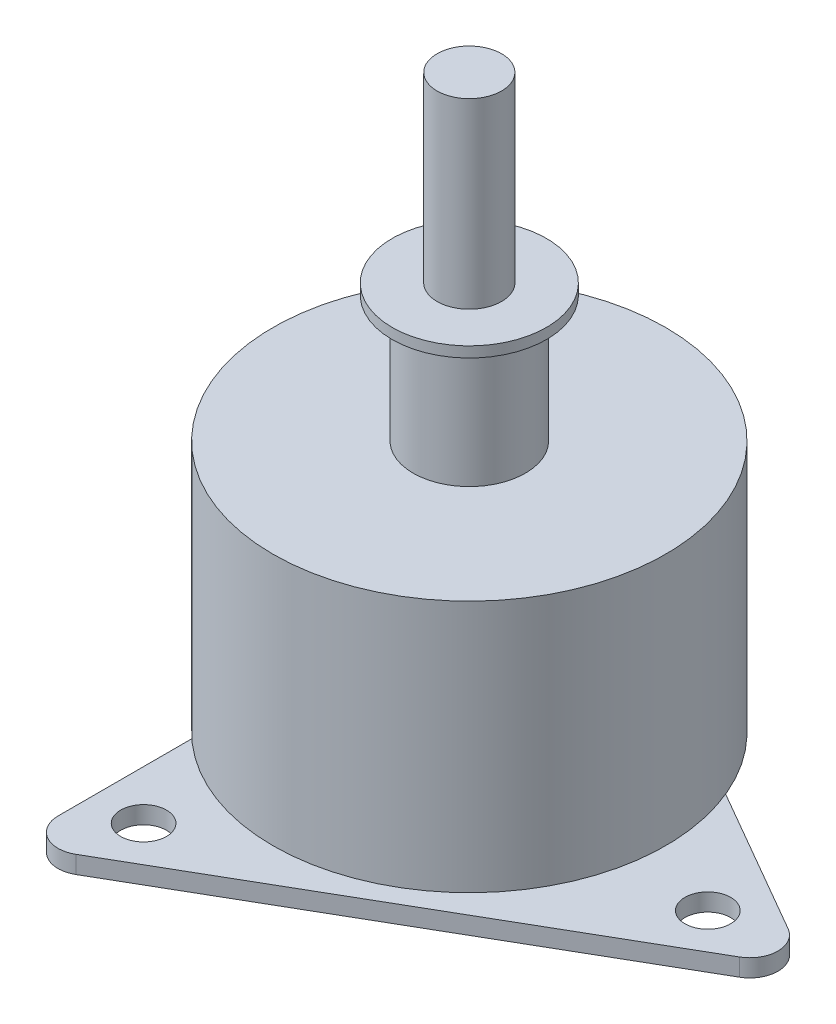
ISO-10303-21;
HEADER;
FILE_DESCRIPTION(('STEP AP214'),'2;1');
FILE_NAME('part.step','',(''),(''),'','','');
FILE_SCHEMA(('AUTOMOTIVE_DESIGN { 1 0 10303 214 1 1 1 1 }'));
ENDSEC;
DATA;
#1=APPLICATION_CONTEXT('core data for automotive mechanical design processes');
#2=APPLICATION_PROTOCOL_DEFINITION('international standard','automotive_design',2000,#1);
#3=PRODUCT_CONTEXT('',#1,'mechanical');
#4=PRODUCT('Part','Part','',(#3));
#5=PRODUCT_RELATED_PRODUCT_CATEGORY('part','',(#4));
#6=PRODUCT_DEFINITION_FORMATION('','',#4);
#7=PRODUCT_DEFINITION_CONTEXT('part definition',#1,'design');
#8=PRODUCT_DEFINITION('design','',#6,#7);
#9=PRODUCT_DEFINITION_SHAPE('','',#8);
#10=(LENGTH_UNIT() NAMED_UNIT(*) SI_UNIT(.MILLI.,.METRE.));
#11=(NAMED_UNIT(*) PLANE_ANGLE_UNIT() SI_UNIT($,.RADIAN.));
#12=(NAMED_UNIT(*) SI_UNIT($,.STERADIAN.) SOLID_ANGLE_UNIT());
#13=UNCERTAINTY_MEASURE_WITH_UNIT(LENGTH_MEASURE(1.E-05),#10,'distance_accuracy_value','');
#14=(GEOMETRIC_REPRESENTATION_CONTEXT(3) GLOBAL_UNCERTAINTY_ASSIGNED_CONTEXT((#13)) GLOBAL_UNIT_ASSIGNED_CONTEXT((#10,
#11,#12)) REPRESENTATION_CONTEXT('',''));
#15=CARTESIAN_POINT('',(0.,0.,0.));
#16=DIRECTION('',(0.,0.,1.));
#17=DIRECTION('',(1.,0.,0.));
#18=AXIS2_PLACEMENT_3D('',#15,#16,#17);
#19=CARTESIAN_POINT('',(0.,0.,0.));
#20=DIRECTION('',(0.,1.,0.));
#21=DIRECTION('',(0.,0.,1.));
#22=AXIS2_PLACEMENT_3D('',#19,#20,#21);
#23=PLANE('',#22);
#24=DIRECTION('',(0.866025403784439,0.,-0.5));
#25=VECTOR('',#24,1.);
#26=CARTESIAN_POINT('',(-12.,0.,20.7846096908265));
#27=LINE('',#26,#25);
#28=CARTESIAN_POINT('',(-9.,0.,19.0525588832576));
#29=VERTEX_POINT('',#28);
#30=CARTESIAN_POINT('',(21.,0.,1.73205080756887));
#31=VERTEX_POINT('',#30);
#32=EDGE_CURVE('E107',#29,#31,#27,.T.);
#33=ORIENTED_EDGE('',*,*,#32,.F.);
#34=CARTESIAN_POINT('',(-10.,0.,17.3205080756888));
#35=DIRECTION('',(0.,1.,0.));
#36=DIRECTION('',(0.,0.,1.));
#37=AXIS2_PLACEMENT_3D('',#34,#35,#36);
#38=CIRCLE('',#37,2.);
#39=CARTESIAN_POINT('',(-12.,0.,17.3205080756888));
#40=VERTEX_POINT('',#39);
#41=EDGE_CURVE('E90',#29,#40,#38,.F.);
#42=ORIENTED_EDGE('',*,*,#41,.T.);
#43=DIRECTION('',(0.,0.,1.));
#44=VECTOR('',#43,1.);
#45=CARTESIAN_POINT('',(-12.,0.,-20.7846096908265));
#46=LINE('',#45,#44);
#47=CARTESIAN_POINT('',(-12.,0.,-17.3205080756888));
#48=VERTEX_POINT('',#47);
#49=EDGE_CURVE('E118',#48,#40,#46,.T.);
#50=ORIENTED_EDGE('',*,*,#49,.F.);
#51=CARTESIAN_POINT('',(-10.,0.,-17.3205080756888));
#52=DIRECTION('',(0.,1.,0.));
#53=DIRECTION('',(0.,0.,1.));
#54=AXIS2_PLACEMENT_3D('',#51,#52,#53);
#55=CIRCLE('',#54,2.);
#56=CARTESIAN_POINT('',(-9.,0.,-19.0525588832577));
#57=VERTEX_POINT('',#56);
#58=EDGE_CURVE('E101',#48,#57,#55,.F.);
#59=ORIENTED_EDGE('',*,*,#58,.T.);
#60=DIRECTION('',(-0.866025403784439,0.,-0.5));
#61=VECTOR('',#60,1.);
#62=CARTESIAN_POINT('',(24.,0.,0.));
#63=LINE('',#62,#61);
#64=CARTESIAN_POINT('',(21.,0.,-1.73205080756889));
#65=VERTEX_POINT('',#64);
#66=EDGE_CURVE('E115',#65,#57,#63,.T.);
#67=ORIENTED_EDGE('',*,*,#66,.F.);
#68=CARTESIAN_POINT('',(20.,0.,0.));
#69=DIRECTION('',(0.,1.,0.));
#70=DIRECTION('',(0.,0.,1.));
#71=AXIS2_PLACEMENT_3D('',#68,#69,#70);
#72=CIRCLE('',#71,2.);
#73=EDGE_CURVE('E110',#65,#31,#72,.F.);
#74=ORIENTED_EDGE('',*,*,#73,.T.);
#75=EDGE_LOOP('',(#33,#42,#50,#59,#67,#74));
#76=FACE_BOUND('',#75,.T.);
#77=CARTESIAN_POINT('',(17.,0.,0.));
#78=DIRECTION('',(0.,1.,0.));
#79=DIRECTION('',(0.,0.,1.));
#80=AXIS2_PLACEMENT_3D('',#77,#78,#79);
#81=CIRCLE('',#80,1.63194999999999);
#82=CARTESIAN_POINT('',(17.,0.,1.63194999999999));
#83=VERTEX_POINT('',#82);
#84=EDGE_CURVE('E116',#83,#83,#81,.F.);
#85=ORIENTED_EDGE('',*,*,#84,.F.);
#86=EDGE_LOOP('',(#85));
#87=FACE_BOUND('',#86,.T.);
#88=CARTESIAN_POINT('',(-8.5,0.,14.7224318643355));
#89=DIRECTION('',(0.,1.,0.));
#90=DIRECTION('',(0.,0.,1.));
#91=AXIS2_PLACEMENT_3D('',#88,#89,#90);
#92=CIRCLE('',#91,1.63194999999999);
#93=CARTESIAN_POINT('',(-8.5,0.,16.3543818643355));
#94=VERTEX_POINT('',#93);
#95=EDGE_CURVE('E157',#94,#94,#92,.F.);
#96=ORIENTED_EDGE('',*,*,#95,.F.);
#97=EDGE_LOOP('',(#96));
#98=FACE_BOUND('',#97,.T.);
#99=CARTESIAN_POINT('',(-8.5,0.,-14.7224318643355));
#100=DIRECTION('',(0.,1.,0.));
#101=DIRECTION('',(0.,0.,1.));
#102=AXIS2_PLACEMENT_3D('',#99,#100,#101);
#103=CIRCLE('',#102,1.63194999999999);
#104=CARTESIAN_POINT('',(-8.5,0.,-13.0904818643355));
#105=VERTEX_POINT('',#104);
#106=EDGE_CURVE('E162',#105,#105,#103,.F.);
#107=ORIENTED_EDGE('',*,*,#106,.F.);
#108=EDGE_LOOP('',(#107));
#109=FACE_BOUND('',#108,.T.);
#110=CARTESIAN_POINT('',(0.,0.,0.));
#111=DIRECTION('',(0.,1.,0.));
#112=DIRECTION('',(0.,0.,1.));
#113=AXIS2_PLACEMENT_3D('',#110,#111,#112);
#114=CIRCLE('',#113,7.5);
#115=CARTESIAN_POINT('',(0.,0.,7.5));
#116=VERTEX_POINT('',#115);
#117=EDGE_CURVE('E128',#116,#116,#114,.F.);
#118=ORIENTED_EDGE('',*,*,#117,.F.);
#119=EDGE_LOOP('',(#118));
#120=FACE_BOUND('',#119,.T.);
#121=ADVANCED_FACE('F37',(#76,#87,#98,#109,#120),#23,.F.);
#122=CARTESIAN_POINT('',(0.,1.25,0.));
#123=DIRECTION('',(0.,1.,0.));
#124=DIRECTION('',(0.,0.,1.));
#125=AXIS2_PLACEMENT_3D('',#122,#123,#124);
#126=PLANE('',#125);
#127=DIRECTION('',(0.,0.,1.));
#128=VECTOR('',#127,1.);
#129=CARTESIAN_POINT('',(-12.,1.25,-20.7846096908265));
#130=LINE('',#129,#128);
#131=CARTESIAN_POINT('',(-12.,1.25,-17.3205080756888));
#132=VERTEX_POINT('',#131);
#133=CARTESIAN_POINT('',(-12.,1.25,17.3205080756888));
#134=VERTEX_POINT('',#133);
#135=EDGE_CURVE('E124',#132,#134,#130,.T.);
#136=ORIENTED_EDGE('',*,*,#135,.T.);
#137=CARTESIAN_POINT('',(-10.,1.25,17.3205080756888));
#138=DIRECTION('',(0.,1.,0.));
#139=DIRECTION('',(0.,0.,1.));
#140=AXIS2_PLACEMENT_3D('',#137,#138,#139);
#141=CIRCLE('',#140,2.);
#142=CARTESIAN_POINT('',(-9.,1.25,19.0525588832576));
#143=VERTEX_POINT('',#142);
#144=EDGE_CURVE('E140',#134,#143,#141,.T.);
#145=ORIENTED_EDGE('',*,*,#144,.T.);
#146=DIRECTION('',(0.866025403784439,0.,-0.5));
#147=VECTOR('',#146,1.);
#148=CARTESIAN_POINT('',(-12.,1.25,20.7846096908265));
#149=LINE('',#148,#147);
#150=CARTESIAN_POINT('',(21.,1.25,1.73205080756887));
#151=VERTEX_POINT('',#150);
#152=EDGE_CURVE('E109',#143,#151,#149,.T.);
#153=ORIENTED_EDGE('',*,*,#152,.T.);
#154=CARTESIAN_POINT('',(20.,1.25,0.));
#155=DIRECTION('',(0.,1.,0.));
#156=DIRECTION('',(0.,0.,1.));
#157=AXIS2_PLACEMENT_3D('',#154,#155,#156);
#158=CIRCLE('',#157,2.);
#159=CARTESIAN_POINT('',(21.,1.25,-1.73205080756889));
#160=VERTEX_POINT('',#159);
#161=EDGE_CURVE('E57',#151,#160,#158,.T.);
#162=ORIENTED_EDGE('',*,*,#161,.T.);
#163=DIRECTION('',(-0.866025403784439,0.,-0.5));
#164=VECTOR('',#163,1.);
#165=CARTESIAN_POINT('',(24.,1.25,0.));
#166=LINE('',#165,#164);
#167=CARTESIAN_POINT('',(-9.,1.25,-19.0525588832577));
#168=VERTEX_POINT('',#167);
#169=EDGE_CURVE('E144',#160,#168,#166,.T.);
#170=ORIENTED_EDGE('',*,*,#169,.T.);
#171=CARTESIAN_POINT('',(-10.,1.25,-17.3205080756888));
#172=DIRECTION('',(0.,1.,0.));
#173=DIRECTION('',(0.,0.,1.));
#174=AXIS2_PLACEMENT_3D('',#171,#172,#173);
#175=CIRCLE('',#174,2.);
#176=EDGE_CURVE('E138',#168,#132,#175,.T.);
#177=ORIENTED_EDGE('',*,*,#176,.T.);
#178=EDGE_LOOP('',(#136,#145,#153,#162,#170,#177));
#179=FACE_BOUND('',#178,.T.);
#180=CARTESIAN_POINT('',(17.,1.25,0.));
#181=DIRECTION('',(0.,1.,0.));
#182=DIRECTION('',(0.,0.,1.));
#183=AXIS2_PLACEMENT_3D('',#180,#181,#182);
#184=CIRCLE('',#183,1.63194999999999);
#185=CARTESIAN_POINT('',(17.,1.25,1.63194999999999));
#186=VERTEX_POINT('',#185);
#187=EDGE_CURVE('E121',#186,#186,#184,.T.);
#188=ORIENTED_EDGE('',*,*,#187,.F.);
#189=EDGE_LOOP('',(#188));
#190=FACE_BOUND('',#189,.T.);
#191=CARTESIAN_POINT('',(-8.5,1.25,14.7224318643355));
#192=DIRECTION('',(0.,1.,0.));
#193=DIRECTION('',(0.,0.,1.));
#194=AXIS2_PLACEMENT_3D('',#191,#192,#193);
#195=CIRCLE('',#194,1.63194999999999);
#196=CARTESIAN_POINT('',(-8.5,1.25,16.3543818643354));
#197=VERTEX_POINT('',#196);
#198=EDGE_CURVE('E159',#197,#197,#195,.T.);
#199=ORIENTED_EDGE('',*,*,#198,.F.);
#200=EDGE_LOOP('',(#199));
#201=FACE_BOUND('',#200,.T.);
#202=CARTESIAN_POINT('',(-8.5,1.25,-14.7224318643355));
#203=DIRECTION('',(0.,1.,0.));
#204=DIRECTION('',(0.,0.,1.));
#205=AXIS2_PLACEMENT_3D('',#202,#203,#204);
#206=CIRCLE('',#205,1.63194999999999);
#207=CARTESIAN_POINT('',(-8.5,1.25,-13.0904818643355));
#208=VERTEX_POINT('',#207);
#209=EDGE_CURVE('E165',#208,#208,#206,.T.);
#210=ORIENTED_EDGE('',*,*,#209,.F.);
#211=EDGE_LOOP('',(#210));
#212=FACE_BOUND('',#211,.T.);
#213=CARTESIAN_POINT('',(0.,1.25,0.));
#214=DIRECTION('',(0.,1.,0.));
#215=DIRECTION('',(0.,0.,1.));
#216=AXIS2_PLACEMENT_3D('',#213,#214,#215);
#217=CIRCLE('',#216,6.);
#218=CARTESIAN_POINT('',(0.,1.25,5.99999999999999));
#219=VERTEX_POINT('',#218);
#220=EDGE_CURVE('E168',#219,#219,#217,.T.);
#221=ORIENTED_EDGE('',*,*,#220,.F.);
#222=EDGE_LOOP('',(#221));
#223=FACE_BOUND('',#222,.T.);
#224=ADVANCED_FACE('F214',(#179,#190,#201,#212,#223),#126,.T.);
#225=CARTESIAN_POINT('',(-12.,1.25,20.7846096908265));
#226=DIRECTION('',(-0.5,0.,-0.866025403784439));
#227=DIRECTION('',(-0.866025403784439,0.,0.5));
#228=AXIS2_PLACEMENT_3D('',#225,#226,#227);
#229=PLANE('',#228);
#230=ORIENTED_EDGE('',*,*,#152,.F.);
#231=DIRECTION('',(0.,-1.,0.));
#232=VECTOR('',#231,1.);
#233=CARTESIAN_POINT('',(-9.,1.25,19.0525588832576));
#234=LINE('',#233,#232);
#235=EDGE_CURVE('E94',#143,#29,#234,.T.);
#236=ORIENTED_EDGE('',*,*,#235,.T.);
#237=ORIENTED_EDGE('',*,*,#32,.T.);
#238=DIRECTION('',(0.,-1.,0.));
#239=VECTOR('',#238,1.);
#240=CARTESIAN_POINT('',(21.,1.25,1.73205080756887));
#241=LINE('',#240,#239);
#242=EDGE_CURVE('E111',#31,#151,#241,.F.);
#243=ORIENTED_EDGE('',*,*,#242,.T.);
#244=EDGE_LOOP('',(#230,#236,#237,#243));
#245=FACE_BOUND('',#244,.T.);
#246=ADVANCED_FACE('F106',(#245),#229,.F.);
#247=CARTESIAN_POINT('',(24.,1.25,0.));
#248=DIRECTION('',(-0.5,0.,0.866025403784439));
#249=DIRECTION('',(0.866025403784439,0.,0.5));
#250=AXIS2_PLACEMENT_3D('',#247,#248,#249);
#251=PLANE('',#250);
#252=ORIENTED_EDGE('',*,*,#66,.T.);
#253=DIRECTION('',(0.,-1.,0.));
#254=VECTOR('',#253,1.);
#255=CARTESIAN_POINT('',(-9.,1.25,-19.0525588832577));
#256=LINE('',#255,#254);
#257=EDGE_CURVE('E11',#57,#168,#256,.F.);
#258=ORIENTED_EDGE('',*,*,#257,.T.);
#259=ORIENTED_EDGE('',*,*,#169,.F.);
#260=DIRECTION('',(0.,-1.,0.));
#261=VECTOR('',#260,1.);
#262=CARTESIAN_POINT('',(21.,1.25,-1.73205080756889));
#263=LINE('',#262,#261);
#264=EDGE_CURVE('E45',#160,#65,#263,.T.);
#265=ORIENTED_EDGE('',*,*,#264,.T.);
#266=EDGE_LOOP('',(#252,#258,#259,#265));
#267=FACE_BOUND('',#266,.T.);
#268=ADVANCED_FACE('F143',(#267),#251,.F.);
#269=CARTESIAN_POINT('',(-12.,1.25,-20.7846096908265));
#270=DIRECTION('',(1.,0.,0.));
#271=DIRECTION('',(0.,0.,-1.));
#272=AXIS2_PLACEMENT_3D('',#269,#270,#271);
#273=PLANE('',#272);
#274=ORIENTED_EDGE('',*,*,#49,.T.);
#275=DIRECTION('',(0.,-1.,0.));
#276=VECTOR('',#275,1.);
#277=CARTESIAN_POINT('',(-12.,1.25,17.3205080756888));
#278=LINE('',#277,#276);
#279=EDGE_CURVE('E95',#40,#134,#278,.F.);
#280=ORIENTED_EDGE('',*,*,#279,.T.);
#281=ORIENTED_EDGE('',*,*,#135,.F.);
#282=DIRECTION('',(0.,-1.,0.));
#283=VECTOR('',#282,1.);
#284=CARTESIAN_POINT('',(-12.,1.25,-17.3205080756888));
#285=LINE('',#284,#283);
#286=EDGE_CURVE('E100',#132,#48,#285,.T.);
#287=ORIENTED_EDGE('',*,*,#286,.T.);
#288=EDGE_LOOP('',(#274,#280,#281,#287));
#289=FACE_BOUND('',#288,.T.);
#290=ADVANCED_FACE('F152',(#289),#273,.F.);
#291=CARTESIAN_POINT('',(17.,1.25,0.));
#292=DIRECTION('',(0.,1.,0.));
#293=DIRECTION('',(0.,0.,1.));
#294=AXIS2_PLACEMENT_3D('',#291,#292,#293);
#295=CYLINDRICAL_SURFACE('',#294,1.63194999999999);
#296=ORIENTED_EDGE('',*,*,#84,.T.);
#297=EDGE_LOOP('',(#296));
#298=FACE_BOUND('',#297,.T.);
#299=ORIENTED_EDGE('',*,*,#187,.T.);
#300=EDGE_LOOP('',(#299));
#301=FACE_BOUND('',#300,.T.);
#302=ADVANCED_FACE('F225',(#298,#301),#295,.F.);
#303=CARTESIAN_POINT('',(-8.5,1.25,14.7224318643355));
#304=DIRECTION('',(0.,1.,0.));
#305=DIRECTION('',(0.,0.,1.));
#306=AXIS2_PLACEMENT_3D('',#303,#304,#305);
#307=CYLINDRICAL_SURFACE('',#306,1.63194999999999);
#308=ORIENTED_EDGE('',*,*,#95,.T.);
#309=EDGE_LOOP('',(#308));
#310=FACE_BOUND('',#309,.T.);
#311=ORIENTED_EDGE('',*,*,#198,.T.);
#312=EDGE_LOOP('',(#311));
#313=FACE_BOUND('',#312,.T.);
#314=ADVANCED_FACE('F260',(#310,#313),#307,.F.);
#315=CARTESIAN_POINT('',(-8.5,1.25,-14.7224318643355));
#316=DIRECTION('',(0.,1.,0.));
#317=DIRECTION('',(0.,0.,1.));
#318=AXIS2_PLACEMENT_3D('',#315,#316,#317);
#319=CYLINDRICAL_SURFACE('',#318,1.63194999999999);
#320=ORIENTED_EDGE('',*,*,#106,.T.);
#321=EDGE_LOOP('',(#320));
#322=FACE_BOUND('',#321,.T.);
#323=ORIENTED_EDGE('',*,*,#209,.T.);
#324=EDGE_LOOP('',(#323));
#325=FACE_BOUND('',#324,.T.);
#326=ADVANCED_FACE('F249',(#322,#325),#319,.F.);
#327=CARTESIAN_POINT('',(0.,44.5,0.));
#328=DIRECTION('',(0.,1.,0.));
#329=DIRECTION('',(0.,0.,1.));
#330=AXIS2_PLACEMENT_3D('',#327,#328,#329);
#331=CYLINDRICAL_SURFACE('',#330,6.);
#332=CARTESIAN_POINT('',(0.,3.75,0.));
#333=DIRECTION('',(0.,1.,0.));
#334=DIRECTION('',(0.,0.,1.));
#335=AXIS2_PLACEMENT_3D('',#332,#333,#334);
#336=CIRCLE('',#335,6.);
#337=CARTESIAN_POINT('',(0.,3.75,5.99999999999999));
#338=VERTEX_POINT('',#337);
#339=EDGE_CURVE('E173',#338,#338,#336,.T.);
#340=ORIENTED_EDGE('',*,*,#339,.F.);
#341=EDGE_LOOP('',(#340));
#342=FACE_BOUND('',#341,.T.);
#343=ORIENTED_EDGE('',*,*,#220,.T.);
#344=EDGE_LOOP('',(#343));
#345=FACE_BOUND('',#344,.T.);
#346=ADVANCED_FACE('F246',(#342,#345),#331,.T.);
#347=CARTESIAN_POINT('',(0.,3.75,-6.00000000000001));
#348=DIRECTION('',(0.,1.,0.));
#349=DIRECTION('',(0.,0.,1.));
#350=AXIS2_PLACEMENT_3D('',#347,#348,#349);
#351=PLANE('',#350);
#352=CARTESIAN_POINT('',(0.,3.75,0.));
#353=DIRECTION('',(0.,1.,0.));
#354=DIRECTION('',(0.,0.,1.));
#355=AXIS2_PLACEMENT_3D('',#352,#353,#354);
#356=CIRCLE('',#355,14.);
#357=CARTESIAN_POINT('',(0.,3.75,14.));
#358=VERTEX_POINT('',#357);
#359=EDGE_CURVE('E176',#358,#358,#356,.T.);
#360=ORIENTED_EDGE('',*,*,#359,.F.);
#361=EDGE_LOOP('',(#360));
#362=FACE_BOUND('',#361,.T.);
#363=ORIENTED_EDGE('',*,*,#339,.T.);
#364=EDGE_LOOP('',(#363));
#365=FACE_BOUND('',#364,.T.);
#366=ADVANCED_FACE('F248',(#362,#365),#351,.F.);
#367=CARTESIAN_POINT('',(0.,44.5,0.));
#368=DIRECTION('',(0.,1.,0.));
#369=DIRECTION('',(0.,0.,1.));
#370=AXIS2_PLACEMENT_3D('',#367,#368,#369);
#371=CYLINDRICAL_SURFACE('',#370,14.);
#372=CARTESIAN_POINT('',(0.,21.75,0.));
#373=DIRECTION('',(0.,1.,0.));
#374=DIRECTION('',(0.,0.,1.));
#375=AXIS2_PLACEMENT_3D('',#372,#373,#374);
#376=CIRCLE('',#375,14.);
#377=CARTESIAN_POINT('',(0.,21.75,14.));
#378=VERTEX_POINT('',#377);
#379=EDGE_CURVE('E179',#378,#378,#376,.T.);
#380=ORIENTED_EDGE('',*,*,#379,.F.);
#381=EDGE_LOOP('',(#380));
#382=FACE_BOUND('',#381,.T.);
#383=ORIENTED_EDGE('',*,*,#359,.T.);
#384=EDGE_LOOP('',(#383));
#385=FACE_BOUND('',#384,.T.);
#386=ADVANCED_FACE('F256',(#382,#385),#371,.T.);
#387=CARTESIAN_POINT('',(0.,21.75,-14.));
#388=DIRECTION('',(0.,-1.,0.));
#389=DIRECTION('',(0.,0.,-1.));
#390=AXIS2_PLACEMENT_3D('',#387,#388,#389);
#391=PLANE('',#390);
#392=CARTESIAN_POINT('',(0.,21.75,0.));
#393=DIRECTION('',(0.,1.,0.));
#394=DIRECTION('',(0.,0.,1.));
#395=AXIS2_PLACEMENT_3D('',#392,#393,#394);
#396=CIRCLE('',#395,4.);
#397=CARTESIAN_POINT('',(0.,21.75,4.));
#398=VERTEX_POINT('',#397);
#399=EDGE_CURVE('E182',#398,#398,#396,.T.);
#400=ORIENTED_EDGE('',*,*,#399,.F.);
#401=EDGE_LOOP('',(#400));
#402=FACE_BOUND('',#401,.T.);
#403=ORIENTED_EDGE('',*,*,#379,.T.);
#404=EDGE_LOOP('',(#403));
#405=FACE_BOUND('',#404,.T.);
#406=ADVANCED_FACE('F398',(#402,#405),#391,.F.);
#407=CARTESIAN_POINT('',(0.,44.5,0.));
#408=DIRECTION('',(0.,1.,0.));
#409=DIRECTION('',(0.,0.,1.));
#410=AXIS2_PLACEMENT_3D('',#407,#408,#409);
#411=CYLINDRICAL_SURFACE('',#410,4.);
#412=CARTESIAN_POINT('',(0.,30.75,0.));
#413=DIRECTION('',(0.,1.,0.));
#414=DIRECTION('',(0.,0.,1.));
#415=AXIS2_PLACEMENT_3D('',#412,#413,#414);
#416=CIRCLE('',#415,4.);
#417=CARTESIAN_POINT('',(0.,30.75,4.));
#418=VERTEX_POINT('',#417);
#419=EDGE_CURVE('E185',#418,#418,#416,.T.);
#420=ORIENTED_EDGE('',*,*,#419,.F.);
#421=EDGE_LOOP('',(#420));
#422=FACE_BOUND('',#421,.T.);
#423=ORIENTED_EDGE('',*,*,#399,.T.);
#424=EDGE_LOOP('',(#423));
#425=FACE_BOUND('',#424,.T.);
#426=ADVANCED_FACE('F390',(#422,#425),#411,.T.);
#427=CARTESIAN_POINT('',(0.,30.75,-4.));
#428=DIRECTION('',(0.,1.,0.));
#429=DIRECTION('',(0.,0.,1.));
#430=AXIS2_PLACEMENT_3D('',#427,#428,#429);
#431=PLANE('',#430);
#432=CARTESIAN_POINT('',(0.,30.75,0.));
#433=DIRECTION('',(0.,1.,0.));
#434=DIRECTION('',(0.,0.,1.));
#435=AXIS2_PLACEMENT_3D('',#432,#433,#434);
#436=CIRCLE('',#435,5.5);
#437=CARTESIAN_POINT('',(0.,30.75,5.5));
#438=VERTEX_POINT('',#437);
#439=EDGE_CURVE('E188',#438,#438,#436,.T.);
#440=ORIENTED_EDGE('',*,*,#439,.F.);
#441=EDGE_LOOP('',(#440));
#442=FACE_BOUND('',#441,.T.);
#443=ORIENTED_EDGE('',*,*,#419,.T.);
#444=EDGE_LOOP('',(#443));
#445=FACE_BOUND('',#444,.T.);
#446=ADVANCED_FACE('F382',(#442,#445),#431,.F.);
#447=CARTESIAN_POINT('',(0.,44.5,0.));
#448=DIRECTION('',(0.,1.,0.));
#449=DIRECTION('',(0.,0.,1.));
#450=AXIS2_PLACEMENT_3D('',#447,#448,#449);
#451=CYLINDRICAL_SURFACE('',#450,5.5);
#452=CARTESIAN_POINT('',(0.,31.5,0.));
#453=DIRECTION('',(0.,1.,0.));
#454=DIRECTION('',(0.,0.,1.));
#455=AXIS2_PLACEMENT_3D('',#452,#453,#454);
#456=CIRCLE('',#455,5.5);
#457=CARTESIAN_POINT('',(0.,31.5,5.5));
#458=VERTEX_POINT('',#457);
#459=EDGE_CURVE('E191',#458,#458,#456,.T.);
#460=ORIENTED_EDGE('',*,*,#459,.F.);
#461=EDGE_LOOP('',(#460));
#462=FACE_BOUND('',#461,.T.);
#463=ORIENTED_EDGE('',*,*,#439,.T.);
#464=EDGE_LOOP('',(#463));
#465=FACE_BOUND('',#464,.T.);
#466=ADVANCED_FACE('F374',(#462,#465),#451,.T.);
#467=CARTESIAN_POINT('',(0.,31.5,-5.5));
#468=DIRECTION('',(0.,-1.,0.));
#469=DIRECTION('',(0.,0.,-1.));
#470=AXIS2_PLACEMENT_3D('',#467,#468,#469);
#471=PLANE('',#470);
#472=CARTESIAN_POINT('',(0.,31.5,0.));
#473=DIRECTION('',(0.,1.,0.));
#474=DIRECTION('',(0.,0.,1.));
#475=AXIS2_PLACEMENT_3D('',#472,#473,#474);
#476=CIRCLE('',#475,2.3);
#477=CARTESIAN_POINT('',(0.,31.5,2.3));
#478=VERTEX_POINT('',#477);
#479=EDGE_CURVE('E194',#478,#478,#476,.T.);
#480=ORIENTED_EDGE('',*,*,#479,.F.);
#481=EDGE_LOOP('',(#480));
#482=FACE_BOUND('',#481,.T.);
#483=ORIENTED_EDGE('',*,*,#459,.T.);
#484=EDGE_LOOP('',(#483));
#485=FACE_BOUND('',#484,.T.);
#486=ADVANCED_FACE('F367',(#482,#485),#471,.F.);
#487=CARTESIAN_POINT('',(0.,44.5,0.));
#488=DIRECTION('',(0.,1.,0.));
#489=DIRECTION('',(0.,0.,1.));
#490=AXIS2_PLACEMENT_3D('',#487,#488,#489);
#491=CYLINDRICAL_SURFACE('',#490,2.3);
#492=CARTESIAN_POINT('',(0.,44.5,0.));
#493=DIRECTION('',(0.,1.,0.));
#494=DIRECTION('',(0.,0.,1.));
#495=AXIS2_PLACEMENT_3D('',#492,#493,#494);
#496=CIRCLE('',#495,2.3);
#497=CARTESIAN_POINT('',(0.,44.5,2.3));
#498=VERTEX_POINT('',#497);
#499=EDGE_CURVE('E197',#498,#498,#496,.T.);
#500=ORIENTED_EDGE('',*,*,#499,.F.);
#501=EDGE_LOOP('',(#500));
#502=FACE_BOUND('',#501,.T.);
#503=ORIENTED_EDGE('',*,*,#479,.T.);
#504=EDGE_LOOP('',(#503));
#505=FACE_BOUND('',#504,.T.);
#506=ADVANCED_FACE('F359',(#502,#505),#491,.T.);
#507=CARTESIAN_POINT('',(0.,44.5,-2.3));
#508=DIRECTION('',(0.,-1.,0.));
#509=DIRECTION('',(0.,0.,-1.));
#510=AXIS2_PLACEMENT_3D('',#507,#508,#509);
#511=PLANE('',#510);
#512=ORIENTED_EDGE('',*,*,#499,.T.);
#513=EDGE_LOOP('',(#512));
#514=FACE_BOUND('',#513,.T.);
#515=ADVANCED_FACE('F209',(#514),#511,.F.);
#516=CARTESIAN_POINT('',(0.,-3.25,0.));
#517=DIRECTION('',(0.,1.,0.));
#518=DIRECTION('',(0.,0.,1.));
#519=AXIS2_PLACEMENT_3D('',#516,#517,#518);
#520=CYLINDRICAL_SURFACE('',#519,7.5);
#521=CARTESIAN_POINT('',(0.,-3.25,0.));
#522=DIRECTION('',(0.,-1.,0.));
#523=DIRECTION('',(0.,0.,-1.));
#524=AXIS2_PLACEMENT_3D('',#521,#522,#523);
#525=CIRCLE('',#524,7.5);
#526=CARTESIAN_POINT('',(0.,-3.25,7.5));
#527=VERTEX_POINT('',#526);
#528=EDGE_CURVE('E200',#527,#527,#525,.T.);
#529=CARTESIAN_POINT('',(0.,-3.25,7.5));
#530=CARTESIAN_POINT('',(0.,-3.21614583333333,7.5));
#531=CARTESIAN_POINT('',(0.,-3.18229166666667,7.5));
#532=CARTESIAN_POINT('',(0.,-3.11458333333333,7.5));
#533=CARTESIAN_POINT('',(0.,-3.08072916666667,7.5));
#534=CARTESIAN_POINT('',(0.,-3.01302083333333,7.5));
#535=CARTESIAN_POINT('',(0.,-2.97916666666667,7.5));
#536=CARTESIAN_POINT('',(0.,-2.91145833333333,7.5));
#537=CARTESIAN_POINT('',(0.,-2.87760416666667,7.5));
#538=CARTESIAN_POINT('',(0.,-2.80989583333333,7.5));
#539=CARTESIAN_POINT('',(0.,-2.77604166666667,7.5));
#540=CARTESIAN_POINT('',(0.,-2.70833333333333,7.5));
#541=CARTESIAN_POINT('',(0.,-2.67447916666667,7.5));
#542=CARTESIAN_POINT('',(0.,-2.60677083333333,7.5));
#543=CARTESIAN_POINT('',(0.,-2.57291666666667,7.5));
#544=CARTESIAN_POINT('',(0.,-2.50520833333333,7.5));
#545=CARTESIAN_POINT('',(0.,-2.47135416666667,7.5));
#546=CARTESIAN_POINT('',(0.,-2.40364583333333,7.5));
#547=CARTESIAN_POINT('',(0.,-2.36979166666667,7.5));
#548=CARTESIAN_POINT('',(0.,-2.30208333333333,7.5));
#549=CARTESIAN_POINT('',(0.,-2.26822916666667,7.5));
#550=CARTESIAN_POINT('',(0.,-2.20052083333333,7.5));
#551=CARTESIAN_POINT('',(0.,-2.16666666666667,7.5));
#552=CARTESIAN_POINT('',(0.,-2.09895833333333,7.5));
#553=CARTESIAN_POINT('',(0.,-2.06510416666667,7.5));
#554=CARTESIAN_POINT('',(0.,-1.99739583333333,7.5));
#555=CARTESIAN_POINT('',(0.,-1.96354166666667,7.5));
#556=CARTESIAN_POINT('',(0.,-1.89583333333333,7.5));
#557=CARTESIAN_POINT('',(0.,-1.86197916666667,7.5));
#558=CARTESIAN_POINT('',(0.,-1.79427083333333,7.5));
#559=CARTESIAN_POINT('',(0.,-1.76041666666667,7.5));
#560=CARTESIAN_POINT('',(0.,-1.69270833333333,7.5));
#561=CARTESIAN_POINT('',(0.,-1.65885416666667,7.5));
#562=CARTESIAN_POINT('',(0.,-1.59114583333333,7.5));
#563=CARTESIAN_POINT('',(0.,-1.55729166666667,7.5));
#564=CARTESIAN_POINT('',(0.,-1.48958333333333,7.5));
#565=CARTESIAN_POINT('',(0.,-1.45572916666667,7.5));
#566=CARTESIAN_POINT('',(0.,-1.38802083333333,7.5));
#567=CARTESIAN_POINT('',(0.,-1.35416666666667,7.5));
#568=CARTESIAN_POINT('',(0.,-1.28645833333333,7.5));
#569=CARTESIAN_POINT('',(0.,-1.25260416666667,7.5));
#570=CARTESIAN_POINT('',(0.,-1.18489583333333,7.5));
#571=CARTESIAN_POINT('',(0.,-1.15104166666667,7.5));
#572=CARTESIAN_POINT('',(0.,-1.08333333333333,7.5));
#573=CARTESIAN_POINT('',(0.,-1.04947916666667,7.5));
#574=CARTESIAN_POINT('',(0.,-0.981770833333333,7.5));
#575=CARTESIAN_POINT('',(0.,-0.947916666666667,7.5));
#576=CARTESIAN_POINT('',(0.,-0.880208333333333,7.5));
#577=CARTESIAN_POINT('',(0.,-0.846354166666667,7.5));
#578=CARTESIAN_POINT('',(0.,-0.778645833333333,7.5));
#579=CARTESIAN_POINT('',(0.,-0.744791666666667,7.5));
#580=CARTESIAN_POINT('',(0.,-0.677083333333333,7.5));
#581=CARTESIAN_POINT('',(0.,-0.643229166666667,7.5));
#582=CARTESIAN_POINT('',(0.,-0.575520833333333,7.5));
#583=CARTESIAN_POINT('',(0.,-0.541666666666667,7.5));
#584=CARTESIAN_POINT('',(0.,-0.473958333333333,7.5));
#585=CARTESIAN_POINT('',(0.,-0.440104166666667,7.5));
#586=CARTESIAN_POINT('',(0.,-0.372395833333333,7.5));
#587=CARTESIAN_POINT('',(0.,-0.338541666666667,7.5));
#588=CARTESIAN_POINT('',(0.,-0.270833333333333,7.5));
#589=CARTESIAN_POINT('',(0.,-0.236979166666667,7.5));
#590=CARTESIAN_POINT('',(0.,-0.169270833333333,7.5));
#591=CARTESIAN_POINT('',(0.,-0.135416666666667,7.5));
#592=CARTESIAN_POINT('',(0.,-0.0677083333333334,7.5));
#593=CARTESIAN_POINT('',(0.,-0.0338541666666667,7.5));
#594=CARTESIAN_POINT('',(0.,0.,7.5));
#595=B_SPLINE_CURVE_WITH_KNOTS('',3,(#529,#530,#531,#532,#533,#534,#535,#536,#537,#538,#539,
#540,#541,#542,#543,#544,#545,#546,#547,#548,#549,#550,#551,#552,#553,#554,#555,#556,#557,#558,
#559,#560,#561,#562,#563,#564,#565,#566,#567,#568,#569,#570,#571,#572,#573,#574,#575,#576,#577,
#578,#579,#580,#581,#582,#583,#584,#585,#586,#587,#588,#589,#590,#591,#592,#593,#594),
.UNSPECIFIED.,.F.,.F.,(4,2,2,2,2,2,2,2,2,2,2,2,2,2,2,2,2,2,2,2,2,2,2,2,2,2,2,2,2,2,2,2,4),(0.,
0.1015625,0.203125,0.3046875,0.40625,0.5078125,0.609375,0.7109375,0.8125,0.9140625,1.015625,
1.1171875,1.21875,1.3203125,1.421875,1.5234375,1.625,1.7265625,1.828125,1.9296875,2.03125,
2.1328125,2.234375,2.3359375,2.4375,2.5390625,2.640625,2.7421875,2.84375,2.9453125,3.046875,
3.1484375,3.25),.UNSPECIFIED.);
#596=EDGE_CURVE('BSEAM206',#527,#116,#595,.T.);
#597=ORIENTED_EDGE('',*,*,#528,.F.);
#598=ORIENTED_EDGE('',*,*,#117,.T.);
#599=ORIENTED_EDGE('',*,*,#596,.T.);
#600=ORIENTED_EDGE('',*,*,#596,.F.);
#601=EDGE_LOOP('',(#597,#599,#598,#600));
#602=FACE_BOUND('',#601,.T.);
#603=ADVANCED_FACE('F206',(#602),#520,.T.);
#604=CARTESIAN_POINT('',(0.,-3.25,0.));
#605=DIRECTION('',(0.,-1.,0.));
#606=DIRECTION('',(0.,0.,-1.));
#607=AXIS2_PLACEMENT_3D('',#604,#605,#606);
#608=PLANE('',#607);
#609=ORIENTED_EDGE('',*,*,#528,.T.);
#610=EDGE_LOOP('',(#609));
#611=FACE_BOUND('',#610,.T.);
#612=ADVANCED_FACE('F204',(#611),#608,.T.);
#613=CARTESIAN_POINT('',(-10.,1.25,17.3205080756888));
#614=DIRECTION('',(0.,-1.,0.));
#615=DIRECTION('',(0.,0.,-1.));
#616=AXIS2_PLACEMENT_3D('',#613,#614,#615);
#617=CYLINDRICAL_SURFACE('',#616,2.);
#618=ORIENTED_EDGE('',*,*,#144,.F.);
#619=ORIENTED_EDGE('',*,*,#279,.F.);
#620=ORIENTED_EDGE('',*,*,#41,.F.);
#621=ORIENTED_EDGE('',*,*,#235,.F.);
#622=EDGE_LOOP('',(#618,#619,#620,#621));
#623=FACE_BOUND('',#622,.T.);
#624=ADVANCED_FACE('F93',(#623),#617,.T.);
#625=CARTESIAN_POINT('',(-10.,1.25,-17.3205080756888));
#626=DIRECTION('',(0.,-1.,0.));
#627=DIRECTION('',(0.,0.,-1.));
#628=AXIS2_PLACEMENT_3D('',#625,#626,#627);
#629=CYLINDRICAL_SURFACE('',#628,2.);
#630=ORIENTED_EDGE('',*,*,#176,.F.);
#631=ORIENTED_EDGE('',*,*,#257,.F.);
#632=ORIENTED_EDGE('',*,*,#58,.F.);
#633=ORIENTED_EDGE('',*,*,#286,.F.);
#634=EDGE_LOOP('',(#630,#631,#632,#633));
#635=FACE_BOUND('',#634,.T.);
#636=ADVANCED_FACE('F149',(#635),#629,.T.);
#637=CARTESIAN_POINT('',(20.,1.25,0.));
#638=DIRECTION('',(0.,-1.,0.));
#639=DIRECTION('',(0.,0.,-1.));
#640=AXIS2_PLACEMENT_3D('',#637,#638,#639);
#641=CYLINDRICAL_SURFACE('',#640,2.);
#642=ORIENTED_EDGE('',*,*,#161,.F.);
#643=ORIENTED_EDGE('',*,*,#242,.F.);
#644=ORIENTED_EDGE('',*,*,#73,.F.);
#645=ORIENTED_EDGE('',*,*,#264,.F.);
#646=EDGE_LOOP('',(#642,#643,#644,#645));
#647=FACE_BOUND('',#646,.T.);
#648=ADVANCED_FACE('F39',(#647),#641,.T.);
#649=CLOSED_SHELL('',(#121,#224,#246,#268,#290,#302,#314,#326,#346,#366,#386,#406,#426,#446,
#466,#486,#506,#515,#603,#612,#624,#636,#648));
#650=MANIFOLD_SOLID_BREP('B2',#649);
#651=ADVANCED_BREP_SHAPE_REPRESENTATION('',(#18,#650),#14);
#652=SHAPE_DEFINITION_REPRESENTATION(#9,#651);
ENDSEC;
END-ISO-10303-21;
